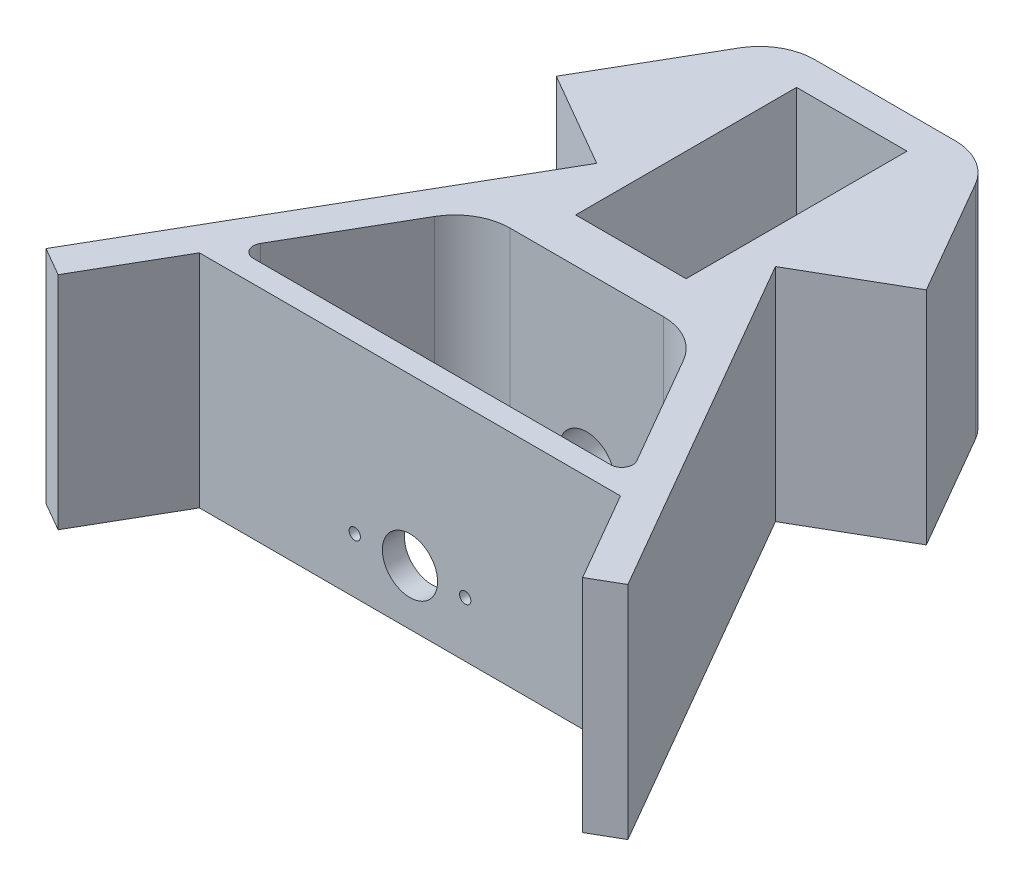
ISO-10303-21;
HEADER;
FILE_DESCRIPTION(('STEP AP214'),'2;1');
FILE_NAME('part.step','',(''),(''),'','','');
FILE_SCHEMA(('AUTOMOTIVE_DESIGN { 1 0 10303 214 1 1 1 1 }'));
ENDSEC;
DATA;
#1=APPLICATION_CONTEXT('core data for automotive mechanical design processes');
#2=APPLICATION_PROTOCOL_DEFINITION('international standard','automotive_design',2000,#1);
#3=PRODUCT_CONTEXT('',#1,'mechanical');
#4=PRODUCT('Part','Part','',(#3));
#5=PRODUCT_RELATED_PRODUCT_CATEGORY('part','',(#4));
#6=PRODUCT_DEFINITION_FORMATION('','',#4);
#7=PRODUCT_DEFINITION_CONTEXT('part definition',#1,'design');
#8=PRODUCT_DEFINITION('design','',#6,#7);
#9=PRODUCT_DEFINITION_SHAPE('','',#8);
#10=(LENGTH_UNIT() NAMED_UNIT(*) SI_UNIT(.MILLI.,.METRE.));
#11=(NAMED_UNIT(*) PLANE_ANGLE_UNIT() SI_UNIT($,.RADIAN.));
#12=(NAMED_UNIT(*) SI_UNIT($,.STERADIAN.) SOLID_ANGLE_UNIT());
#13=UNCERTAINTY_MEASURE_WITH_UNIT(LENGTH_MEASURE(1.E-05),#10,'distance_accuracy_value','');
#14=(GEOMETRIC_REPRESENTATION_CONTEXT(3) GLOBAL_UNCERTAINTY_ASSIGNED_CONTEXT((#13)) GLOBAL_UNIT_ASSIGNED_CONTEXT((#10,
#11,#12)) REPRESENTATION_CONTEXT('',''));
#15=CARTESIAN_POINT('',(0.,0.,0.));
#16=DIRECTION('',(0.,0.,1.));
#17=DIRECTION('',(1.,0.,0.));
#18=AXIS2_PLACEMENT_3D('',#15,#16,#17);
#19=CARTESIAN_POINT('',(35.8094010767585,20.,46.0000000000005));
#20=DIRECTION('',(0.,0.,-1.));
#21=DIRECTION('',(-1.,0.,0.));
#22=AXIS2_PLACEMENT_3D('',#19,#20,#21);
#23=PLANE('',#22);
#24=DIRECTION('',(1.,0.,0.));
#25=VECTOR('',#24,1.);
#26=CARTESIAN_POINT('',(35.8094010767585,20.,46.0000000000005));
#27=LINE('',#26,#25);
#28=CARTESIAN_POINT('',(-32.3452994616208,20.,46.0000000000005));
#29=VERTEX_POINT('',#28);
#30=CARTESIAN_POINT('',(32.3452994616207,20.,46.0000000000005));
#31=VERTEX_POINT('',#30);
#32=EDGE_CURVE('E245',#29,#31,#27,.T.);
#33=ORIENTED_EDGE('',*,*,#32,.T.);
#34=DIRECTION('',(0.,-1.,0.));
#35=VECTOR('',#34,1.);
#36=CARTESIAN_POINT('',(32.3452994616207,-20.,46.0000000000005));
#37=LINE('',#36,#35);
#38=CARTESIAN_POINT('',(32.3452994616207,-20.,46.0000000000005));
#39=VERTEX_POINT('',#38);
#40=EDGE_CURVE('E378',#31,#39,#37,.T.);
#41=ORIENTED_EDGE('',*,*,#40,.T.);
#42=DIRECTION('',(1.,0.,0.));
#43=VECTOR('',#42,1.);
#44=CARTESIAN_POINT('',(35.8094010767585,-20.,46.0000000000005));
#45=LINE('',#44,#43);
#46=CARTESIAN_POINT('',(-32.3452994616208,-20.,46.0000000000005));
#47=VERTEX_POINT('',#46);
#48=EDGE_CURVE('E394',#47,#39,#45,.T.);
#49=ORIENTED_EDGE('',*,*,#48,.F.);
#50=DIRECTION('',(0.,-1.,0.));
#51=VECTOR('',#50,1.);
#52=CARTESIAN_POINT('',(-32.3452994616207,20.,46.0000000000005));
#53=LINE('',#52,#51);
#54=EDGE_CURVE('E376',#47,#29,#53,.F.);
#55=ORIENTED_EDGE('',*,*,#54,.T.);
#56=EDGE_LOOP('',(#33,#41,#49,#55));
#57=FACE_BOUND('',#56,.T.);
#58=CARTESIAN_POINT('',(0.,-10.,46.0000000000005));
#59=DIRECTION('',(0.,0.,-1.));
#60=DIRECTION('',(-1.,0.,0.));
#61=AXIS2_PLACEMENT_3D('',#58,#59,#60);
#62=CIRCLE('',#61,5.);
#63=CARTESIAN_POINT('',(-5.,-10.,46.0000000000005));
#64=VERTEX_POINT('',#63);
#65=EDGE_CURVE('E40',#64,#64,#62,.T.);
#66=ORIENTED_EDGE('',*,*,#65,.F.);
#67=EDGE_LOOP('',(#66));
#68=FACE_BOUND('',#67,.T.);
#69=CARTESIAN_POINT('',(10.,-10.,46.0000000000005));
#70=DIRECTION('',(0.,0.,-1.));
#71=DIRECTION('',(-1.,0.,0.));
#72=AXIS2_PLACEMENT_3D('',#69,#70,#71);
#73=CIRCLE('',#72,1.025);
#74=CARTESIAN_POINT('',(8.975,-10.,46.0000000000005));
#75=VERTEX_POINT('',#74);
#76=EDGE_CURVE('E592',#75,#75,#73,.F.);
#77=ORIENTED_EDGE('',*,*,#76,.T.);
#78=EDGE_LOOP('',(#77));
#79=FACE_BOUND('',#78,.T.);
#80=CARTESIAN_POINT('',(-10.,-10.,46.0000000000005));
#81=DIRECTION('',(0.,0.,-1.));
#82=DIRECTION('',(-1.,0.,0.));
#83=AXIS2_PLACEMENT_3D('',#80,#81,#82);
#84=CIRCLE('',#83,1.025);
#85=CARTESIAN_POINT('',(-11.025,-10.,46.0000000000005));
#86=VERTEX_POINT('',#85);
#87=EDGE_CURVE('E598',#86,#86,#84,.F.);
#88=ORIENTED_EDGE('',*,*,#87,.T.);
#89=EDGE_LOOP('',(#88));
#90=FACE_BOUND('',#89,.T.);
#91=ADVANCED_FACE('F36',(#57,#68,#79,#90),#23,.T.);
#92=CARTESIAN_POINT('',(0.,20.,0.));
#93=DIRECTION('',(0.,-1.,0.));
#94=DIRECTION('',(0.,0.,-1.));
#95=AXIS2_PLACEMENT_3D('',#92,#93,#94);
#96=PLANE('',#95);
#97=DIRECTION('',(0.,0.,1.));
#98=VECTOR('',#97,1.);
#99=CARTESIAN_POINT('',(-10.,20.,10.0000000000004));
#100=LINE('',#99,#98);
#101=CARTESIAN_POINT('',(-10.,20.,-29.9999999999995));
#102=VERTEX_POINT('',#101);
#103=CARTESIAN_POINT('',(-10.,20.,10.0000000000004));
#104=VERTEX_POINT('',#103);
#105=EDGE_CURVE('E211',#102,#104,#100,.T.);
#106=ORIENTED_EDGE('',*,*,#105,.F.);
#107=DIRECTION('',(-1.,0.,0.));
#108=VECTOR('',#107,1.);
#109=CARTESIAN_POINT('',(10.,20.,-29.9999999999995));
#110=LINE('',#109,#108);
#111=CARTESIAN_POINT('',(10.,20.,-29.9999999999995));
#112=VERTEX_POINT('',#111);
#113=EDGE_CURVE('E238',#112,#102,#110,.T.);
#114=ORIENTED_EDGE('',*,*,#113,.F.);
#115=DIRECTION('',(0.,0.,-1.));
#116=VECTOR('',#115,1.);
#117=CARTESIAN_POINT('',(10.,20.,10.0000000000004));
#118=LINE('',#117,#116);
#119=CARTESIAN_POINT('',(10.,20.,10.0000000000004));
#120=VERTEX_POINT('',#119);
#121=EDGE_CURVE('E236',#120,#112,#118,.T.);
#122=ORIENTED_EDGE('',*,*,#121,.F.);
#123=DIRECTION('',(1.,0.,0.));
#124=VECTOR('',#123,1.);
#125=CARTESIAN_POINT('',(10.,20.,10.0000000000004));
#126=LINE('',#125,#124);
#127=EDGE_CURVE('E221',#104,#120,#126,.T.);
#128=ORIENTED_EDGE('',*,*,#127,.F.);
#129=EDGE_LOOP('',(#106,#114,#122,#128));
#130=FACE_BOUND('',#129,.T.);
#131=DIRECTION('',(-1.,0.,0.));
#132=VECTOR('',#131,1.);
#133=CARTESIAN_POINT('',(18.48889300107,20.,-35.9999999999995));
#134=LINE('',#133,#132);
#135=CARTESIAN_POINT('',(12.7153903091737,20.,-35.9999999999995));
#136=VERTEX_POINT('',#135);
#137=CARTESIAN_POINT('',(-12.7153903091737,20.,-35.9999999999996));
#138=VERTEX_POINT('',#137);
#139=EDGE_CURVE('E273',#136,#138,#134,.T.);
#140=ORIENTED_EDGE('',*,*,#139,.T.);
#141=CARTESIAN_POINT('',(-12.7153903091737,20.,-25.9999999999996));
#142=DIRECTION('',(0.,-1.,0.));
#143=DIRECTION('',(0.,0.,-1.));
#144=AXIS2_PLACEMENT_3D('',#141,#142,#143);
#145=CIRCLE('',#144,10.);
#146=CARTESIAN_POINT('',(-21.3756443470181,20.,-30.9999999999995));
#147=VERTEX_POINT('',#146);
#148=EDGE_CURVE('E363',#138,#147,#145,.F.);
#149=ORIENTED_EDGE('',*,*,#148,.T.);
#150=DIRECTION('',(-0.499999999999998,0.,0.86602540378444));
#151=VECTOR('',#150,1.);
#152=CARTESIAN_POINT('',(-18.48889300107,20.,-35.9999999999996));
#153=LINE('',#152,#151);
#154=CARTESIAN_POINT('',(-33.5000000000002,20.,-9.99999999999941));
#155=VERTEX_POINT('',#154);
#156=EDGE_CURVE('E276',#147,#155,#153,.T.);
#157=ORIENTED_EDGE('',*,*,#156,.T.);
#158=DIRECTION('',(0.866025403784451,0.,0.499999999999978));
#159=VECTOR('',#158,1.);
#160=CARTESIAN_POINT('',(-33.5000000000002,20.,-9.99999999999941));
#161=LINE('',#160,#159);
#162=CARTESIAN_POINT('',(-16.1794919243112,20.,1.5231539567342E-13));
#163=VERTEX_POINT('',#162);
#164=EDGE_CURVE('E278',#155,#163,#161,.T.);
#165=ORIENTED_EDGE('',*,*,#164,.T.);
#166=DIRECTION('',(-0.499999999999998,0.,0.86602540378444));
#167=VECTOR('',#166,1.);
#168=CARTESIAN_POINT('',(-16.1794919243112,20.,1.5231539567342E-13));
#169=LINE('',#168,#167);
#170=CARTESIAN_POINT('',(-52.6794919243111,20.,63.2198544762643));
#171=VERTEX_POINT('',#170);
#172=EDGE_CURVE('E280',#163,#171,#169,.T.);
#173=ORIENTED_EDGE('',*,*,#172,.T.);
#174=DIRECTION('',(0.866025403784438,0.,0.500000000000001));
#175=VECTOR('',#174,1.);
#176=CARTESIAN_POINT('',(-52.6794919243111,20.,63.2198544762643));
#177=LINE('',#176,#175);
#178=CARTESIAN_POINT('',(-47.4833395016044,20.,66.2198544762643));
#179=VERTEX_POINT('',#178);
#180=EDGE_CURVE('E282',#171,#179,#177,.T.);
#181=ORIENTED_EDGE('',*,*,#180,.T.);
#182=DIRECTION('',(0.5,0.,-0.866025403784439));
#183=VECTOR('',#182,1.);
#184=CARTESIAN_POINT('',(-47.4833395016044,20.,66.2198544762643));
#185=LINE('',#184,#183);
#186=CARTESIAN_POINT('',(-38.118802153517,20.,50.0000000000005));
#187=VERTEX_POINT('',#186);
#188=EDGE_CURVE('E256',#179,#187,#185,.T.);
#189=ORIENTED_EDGE('',*,*,#188,.T.);
#190=DIRECTION('',(1.,0.,0.));
#191=VECTOR('',#190,1.);
#192=CARTESIAN_POINT('',(-38.118802153517,20.,50.0000000000005));
#193=LINE('',#192,#191);
#194=CARTESIAN_POINT('',(38.118802153517,20.,50.0000000000005));
#195=VERTEX_POINT('',#194);
#196=EDGE_CURVE('E259',#187,#195,#193,.T.);
#197=ORIENTED_EDGE('',*,*,#196,.T.);
#198=DIRECTION('',(0.5,0.,0.866025403784439));
#199=VECTOR('',#198,1.);
#200=CARTESIAN_POINT('',(38.118802153517,20.,50.0000000000005));
#201=LINE('',#200,#199);
#202=CARTESIAN_POINT('',(47.4833395016045,20.,66.2198544762645));
#203=VERTEX_POINT('',#202);
#204=EDGE_CURVE('E262',#195,#203,#201,.T.);
#205=ORIENTED_EDGE('',*,*,#204,.T.);
#206=DIRECTION('',(0.866025403784422,0.,-0.50000000000003));
#207=VECTOR('',#206,1.);
#208=CARTESIAN_POINT('',(47.4833395016045,20.,66.2198544762645));
#209=LINE('',#208,#207);
#210=CARTESIAN_POINT('',(52.6794919243111,20.,63.2198544762643));
#211=VERTEX_POINT('',#210);
#212=EDGE_CURVE('E264',#203,#211,#209,.T.);
#213=ORIENTED_EDGE('',*,*,#212,.T.);
#214=DIRECTION('',(-0.499999999999998,0.,-0.86602540378444));
#215=VECTOR('',#214,1.);
#216=CARTESIAN_POINT('',(52.6794919243111,20.,63.2198544762643));
#217=LINE('',#216,#215);
#218=CARTESIAN_POINT('',(16.1794919243112,20.,1.5231539567342E-13));
#219=VERTEX_POINT('',#218);
#220=EDGE_CURVE('E266',#211,#219,#217,.T.);
#221=ORIENTED_EDGE('',*,*,#220,.T.);
#222=DIRECTION('',(0.86602540378444,0.,-0.499999999999998));
#223=VECTOR('',#222,1.);
#224=CARTESIAN_POINT('',(16.1794919243112,20.,1.5231539567342E-13));
#225=LINE('',#224,#223);
#226=CARTESIAN_POINT('',(33.5,20.,-9.99999999999981));
#227=VERTEX_POINT('',#226);
#228=EDGE_CURVE('E268',#219,#227,#225,.T.);
#229=ORIENTED_EDGE('',*,*,#228,.T.);
#230=DIRECTION('',(-0.499999999999998,0.,-0.86602540378444));
#231=VECTOR('',#230,1.);
#232=CARTESIAN_POINT('',(33.5,20.,-9.99999999999981));
#233=LINE('',#232,#231);
#234=CARTESIAN_POINT('',(21.3756443470181,20.,-30.9999999999995));
#235=VERTEX_POINT('',#234);
#236=EDGE_CURVE('E270',#227,#235,#233,.T.);
#237=ORIENTED_EDGE('',*,*,#236,.T.);
#238=CARTESIAN_POINT('',(12.7153903091737,20.,-25.9999999999995));
#239=DIRECTION('',(0.,-1.,0.));
#240=DIRECTION('',(0.,0.,-1.));
#241=AXIS2_PLACEMENT_3D('',#238,#239,#240);
#242=CIRCLE('',#241,10.);
#243=EDGE_CURVE('E361',#235,#136,#242,.F.);
#244=ORIENTED_EDGE('',*,*,#243,.T.);
#245=EDGE_LOOP('',(#140,#149,#157,#165,#173,#181,#189,#197,#205,#213,#221,#229,#237,#244));
#246=FACE_BOUND('',#245,.T.);
#247=DIRECTION('',(-0.499999999999997,0.,-0.86602540378444));
#248=VECTOR('',#247,1.);
#249=CARTESIAN_POINT('',(19.6435935394491,20.,18.0000000000005));
#250=LINE('',#249,#248);
#251=CARTESIAN_POINT('',(34.0773502691896,20.,43.0000000000005));
#252=VERTEX_POINT('',#251);
#253=CARTESIAN_POINT('',(22.5303448853972,20.,23.0000000000005));
#254=VERTEX_POINT('',#253);
#255=EDGE_CURVE('E401',#252,#254,#250,.T.);
#256=ORIENTED_EDGE('',*,*,#255,.F.);
#257=CARTESIAN_POINT('',(32.3452994616207,20.,44.0000000000005));
#258=DIRECTION('',(0.,-1.,0.));
#259=DIRECTION('',(0.,0.,-1.));
#260=AXIS2_PLACEMENT_3D('',#257,#258,#259);
#261=CIRCLE('',#260,2.);
#262=EDGE_CURVE('E387',#252,#31,#261,.T.);
#263=ORIENTED_EDGE('',*,*,#262,.T.);
#264=ORIENTED_EDGE('',*,*,#32,.F.);
#265=CARTESIAN_POINT('',(-32.3452994616207,20.,44.0000000000005));
#266=DIRECTION('',(0.,-1.,0.));
#267=DIRECTION('',(0.,0.,-1.));
#268=AXIS2_PLACEMENT_3D('',#265,#266,#267);
#269=CIRCLE('',#268,2.);
#270=CARTESIAN_POINT('',(-34.0773502691896,20.,43.0000000000005));
#271=VERTEX_POINT('',#270);
#272=EDGE_CURVE('E11',#29,#271,#269,.T.);
#273=ORIENTED_EDGE('',*,*,#272,.T.);
#274=DIRECTION('',(-0.499999999999998,0.,0.86602540378444));
#275=VECTOR('',#274,1.);
#276=CARTESIAN_POINT('',(-35.8094010767585,20.,46.0000000000005));
#277=LINE('',#276,#275);
#278=CARTESIAN_POINT('',(-22.5303448853972,20.,23.0000000000005));
#279=VERTEX_POINT('',#278);
#280=EDGE_CURVE('E405',#279,#271,#277,.T.);
#281=ORIENTED_EDGE('',*,*,#280,.F.);
#282=CARTESIAN_POINT('',(-13.8700908475528,20.,28.0000000000005));
#283=DIRECTION('',(0.,-1.,0.));
#284=DIRECTION('',(0.,0.,-1.));
#285=AXIS2_PLACEMENT_3D('',#282,#283,#284);
#286=CIRCLE('',#285,10.);
#287=CARTESIAN_POINT('',(-13.8700908475528,20.,18.0000000000005));
#288=VERTEX_POINT('',#287);
#289=EDGE_CURVE('E374',#279,#288,#286,.T.);
#290=ORIENTED_EDGE('',*,*,#289,.T.);
#291=DIRECTION('',(-1.,0.,0.));
#292=VECTOR('',#291,1.);
#293=CARTESIAN_POINT('',(-19.6435935394491,20.,18.0000000000005));
#294=LINE('',#293,#292);
#295=CARTESIAN_POINT('',(13.8700908475528,20.,18.0000000000005));
#296=VERTEX_POINT('',#295);
#297=EDGE_CURVE('E407',#296,#288,#294,.T.);
#298=ORIENTED_EDGE('',*,*,#297,.F.);
#299=CARTESIAN_POINT('',(13.8700908475528,20.,28.0000000000005));
#300=DIRECTION('',(0.,-1.,0.));
#301=DIRECTION('',(0.,0.,-1.));
#302=AXIS2_PLACEMENT_3D('',#299,#300,#301);
#303=CIRCLE('',#302,10.);
#304=EDGE_CURVE('E369',#296,#254,#303,.T.);
#305=ORIENTED_EDGE('',*,*,#304,.T.);
#306=EDGE_LOOP('',(#256,#263,#264,#273,#281,#290,#298,#305));
#307=FACE_BOUND('',#306,.T.);
#308=ADVANCED_FACE('F233',(#130,#246,#307),#96,.F.);
#309=CARTESIAN_POINT('',(0.,-20.,0.));
#310=DIRECTION('',(0.,-1.,0.));
#311=DIRECTION('',(0.,0.,-1.));
#312=AXIS2_PLACEMENT_3D('',#309,#310,#311);
#313=PLANE('',#312);
#314=DIRECTION('',(-0.499999999999998,0.,0.86602540378444));
#315=VECTOR('',#314,1.);
#316=CARTESIAN_POINT('',(-18.48889300107,-20.,-35.9999999999996));
#317=LINE('',#316,#315);
#318=CARTESIAN_POINT('',(-21.3756443470181,-20.,-30.9999999999995));
#319=VERTEX_POINT('',#318);
#320=CARTESIAN_POINT('',(-33.5000000000002,-20.,-9.99999999999941));
#321=VERTEX_POINT('',#320);
#322=EDGE_CURVE('E303',#319,#321,#317,.T.);
#323=ORIENTED_EDGE('',*,*,#322,.F.);
#324=CARTESIAN_POINT('',(-12.7153903091737,-20.,-25.9999999999996));
#325=DIRECTION('',(0.,-1.,0.));
#326=DIRECTION('',(0.,0.,-1.));
#327=AXIS2_PLACEMENT_3D('',#324,#325,#326);
#328=CIRCLE('',#327,10.);
#329=CARTESIAN_POINT('',(-12.7153903091737,-20.,-35.9999999999996));
#330=VERTEX_POINT('',#329);
#331=EDGE_CURVE('E354',#319,#330,#328,.T.);
#332=ORIENTED_EDGE('',*,*,#331,.T.);
#333=DIRECTION('',(-1.,0.,0.));
#334=VECTOR('',#333,1.);
#335=CARTESIAN_POINT('',(18.48889300107,-20.,-35.9999999999995));
#336=LINE('',#335,#334);
#337=CARTESIAN_POINT('',(12.7153903091737,-20.,-35.9999999999995));
#338=VERTEX_POINT('',#337);
#339=EDGE_CURVE('E300',#338,#330,#336,.T.);
#340=ORIENTED_EDGE('',*,*,#339,.F.);
#341=CARTESIAN_POINT('',(12.7153903091737,-20.,-25.9999999999995));
#342=DIRECTION('',(0.,-1.,0.));
#343=DIRECTION('',(0.,0.,-1.));
#344=AXIS2_PLACEMENT_3D('',#341,#342,#343);
#345=CIRCLE('',#344,10.);
#346=CARTESIAN_POINT('',(21.3756443470181,-20.,-30.9999999999995));
#347=VERTEX_POINT('',#346);
#348=EDGE_CURVE('E352',#338,#347,#345,.T.);
#349=ORIENTED_EDGE('',*,*,#348,.T.);
#350=DIRECTION('',(-0.499999999999998,0.,-0.86602540378444));
#351=VECTOR('',#350,1.);
#352=CARTESIAN_POINT('',(33.5,-20.,-9.99999999999981));
#353=LINE('',#352,#351);
#354=CARTESIAN_POINT('',(33.5,-20.,-9.99999999999981));
#355=VERTEX_POINT('',#354);
#356=EDGE_CURVE('E297',#355,#347,#353,.T.);
#357=ORIENTED_EDGE('',*,*,#356,.F.);
#358=DIRECTION('',(0.86602540378444,0.,-0.499999999999998));
#359=VECTOR('',#358,1.);
#360=CARTESIAN_POINT('',(16.1794919243112,-20.,1.5231539567342E-13));
#361=LINE('',#360,#359);
#362=CARTESIAN_POINT('',(16.1794919243112,-20.,1.5231539567342E-13));
#363=VERTEX_POINT('',#362);
#364=EDGE_CURVE('E295',#363,#355,#361,.T.);
#365=ORIENTED_EDGE('',*,*,#364,.F.);
#366=DIRECTION('',(-0.499999999999998,0.,-0.86602540378444));
#367=VECTOR('',#366,1.);
#368=CARTESIAN_POINT('',(52.6794919243111,-20.,63.2198544762643));
#369=LINE('',#368,#367);
#370=CARTESIAN_POINT('',(52.6794919243111,-20.,63.2198544762643));
#371=VERTEX_POINT('',#370);
#372=EDGE_CURVE('E293',#371,#363,#369,.T.);
#373=ORIENTED_EDGE('',*,*,#372,.F.);
#374=DIRECTION('',(0.866025403784422,0.,-0.50000000000003));
#375=VECTOR('',#374,1.);
#376=CARTESIAN_POINT('',(47.4833395016045,-20.,66.2198544762645));
#377=LINE('',#376,#375);
#378=CARTESIAN_POINT('',(47.4833395016045,-20.,66.2198544762645));
#379=VERTEX_POINT('',#378);
#380=EDGE_CURVE('E291',#379,#371,#377,.T.);
#381=ORIENTED_EDGE('',*,*,#380,.F.);
#382=DIRECTION('',(0.5,0.,0.866025403784439));
#383=VECTOR('',#382,1.);
#384=CARTESIAN_POINT('',(38.118802153517,-20.,50.0000000000005));
#385=LINE('',#384,#383);
#386=CARTESIAN_POINT('',(38.118802153517,-20.,50.0000000000005));
#387=VERTEX_POINT('',#386);
#388=EDGE_CURVE('E289',#387,#379,#385,.T.);
#389=ORIENTED_EDGE('',*,*,#388,.F.);
#390=DIRECTION('',(1.,0.,0.));
#391=VECTOR('',#390,1.);
#392=CARTESIAN_POINT('',(-38.118802153517,-20.,50.0000000000005));
#393=LINE('',#392,#391);
#394=CARTESIAN_POINT('',(-38.118802153517,-20.,50.0000000000005));
#395=VERTEX_POINT('',#394);
#396=EDGE_CURVE('E287',#395,#387,#393,.T.);
#397=ORIENTED_EDGE('',*,*,#396,.F.);
#398=DIRECTION('',(0.5,0.,-0.866025403784439));
#399=VECTOR('',#398,1.);
#400=CARTESIAN_POINT('',(-47.4833395016044,-20.,66.2198544762643));
#401=LINE('',#400,#399);
#402=CARTESIAN_POINT('',(-47.4833395016044,-20.,66.2198544762643));
#403=VERTEX_POINT('',#402);
#404=EDGE_CURVE('E229',#403,#395,#401,.T.);
#405=ORIENTED_EDGE('',*,*,#404,.F.);
#406=DIRECTION('',(0.866025403784438,0.,0.500000000000001));
#407=VECTOR('',#406,1.);
#408=CARTESIAN_POINT('',(-52.6794919243111,-20.,63.2198544762643));
#409=LINE('',#408,#407);
#410=CARTESIAN_POINT('',(-52.6794919243111,-20.,63.2198544762643));
#411=VERTEX_POINT('',#410);
#412=EDGE_CURVE('E260',#411,#403,#409,.T.);
#413=ORIENTED_EDGE('',*,*,#412,.F.);
#414=DIRECTION('',(-0.499999999999998,0.,0.86602540378444));
#415=VECTOR('',#414,1.);
#416=CARTESIAN_POINT('',(-16.1794919243112,-20.,1.5231539567342E-13));
#417=LINE('',#416,#415);
#418=CARTESIAN_POINT('',(-16.1794919243112,-20.,1.5231539567342E-13));
#419=VERTEX_POINT('',#418);
#420=EDGE_CURVE('E307',#419,#411,#417,.T.);
#421=ORIENTED_EDGE('',*,*,#420,.F.);
#422=DIRECTION('',(0.866025403784451,0.,0.499999999999978));
#423=VECTOR('',#422,1.);
#424=CARTESIAN_POINT('',(-33.5000000000002,-20.,-9.99999999999941));
#425=LINE('',#424,#423);
#426=EDGE_CURVE('E305',#321,#419,#425,.T.);
#427=ORIENTED_EDGE('',*,*,#426,.F.);
#428=EDGE_LOOP('',(#323,#332,#340,#349,#357,#365,#373,#381,#389,#397,#405,#413,#421,#427));
#429=FACE_BOUND('',#428,.T.);
#430=DIRECTION('',(-1.,0.,0.));
#431=VECTOR('',#430,1.);
#432=CARTESIAN_POINT('',(10.,-20.,-29.9999999999995));
#433=LINE('',#432,#431);
#434=CARTESIAN_POINT('',(10.,-20.,-29.9999999999995));
#435=VERTEX_POINT('',#434);
#436=CARTESIAN_POINT('',(-10.,-20.,-29.9999999999995));
#437=VERTEX_POINT('',#436);
#438=EDGE_CURVE('E222',#435,#437,#433,.T.);
#439=ORIENTED_EDGE('',*,*,#438,.T.);
#440=DIRECTION('',(0.,0.,1.));
#441=VECTOR('',#440,1.);
#442=CARTESIAN_POINT('',(-10.,-20.,10.0000000000004));
#443=LINE('',#442,#441);
#444=CARTESIAN_POINT('',(-10.,-20.,10.0000000000004));
#445=VERTEX_POINT('',#444);
#446=EDGE_CURVE('E243',#437,#445,#443,.T.);
#447=ORIENTED_EDGE('',*,*,#446,.T.);
#448=DIRECTION('',(1.,0.,0.));
#449=VECTOR('',#448,1.);
#450=CARTESIAN_POINT('',(10.,-20.,10.0000000000004));
#451=LINE('',#450,#449);
#452=CARTESIAN_POINT('',(10.,-20.,10.0000000000004));
#453=VERTEX_POINT('',#452);
#454=EDGE_CURVE('E228',#445,#453,#451,.T.);
#455=ORIENTED_EDGE('',*,*,#454,.T.);
#456=DIRECTION('',(0.,0.,-1.));
#457=VECTOR('',#456,1.);
#458=CARTESIAN_POINT('',(10.,-20.,10.0000000000004));
#459=LINE('',#458,#457);
#460=EDGE_CURVE('E247',#453,#435,#459,.T.);
#461=ORIENTED_EDGE('',*,*,#460,.T.);
#462=EDGE_LOOP('',(#439,#447,#455,#461));
#463=FACE_BOUND('',#462,.T.);
#464=DIRECTION('',(-0.499999999999998,0.,0.86602540378444));
#465=VECTOR('',#464,1.);
#466=CARTESIAN_POINT('',(-35.8094010767585,-20.,46.0000000000005));
#467=LINE('',#466,#465);
#468=CARTESIAN_POINT('',(-22.5303448853972,-20.,23.0000000000005));
#469=VERTEX_POINT('',#468);
#470=CARTESIAN_POINT('',(-34.0773502691896,-20.,43.0000000000005));
#471=VERTEX_POINT('',#470);
#472=EDGE_CURVE('E396',#469,#471,#467,.T.);
#473=ORIENTED_EDGE('',*,*,#472,.T.);
#474=CARTESIAN_POINT('',(-32.3452994616207,-20.,44.0000000000005));
#475=DIRECTION('',(0.,-1.,0.));
#476=DIRECTION('',(0.,0.,-1.));
#477=AXIS2_PLACEMENT_3D('',#474,#475,#476);
#478=CIRCLE('',#477,2.);
#479=EDGE_CURVE('E45',#471,#47,#478,.F.);
#480=ORIENTED_EDGE('',*,*,#479,.T.);
#481=ORIENTED_EDGE('',*,*,#48,.T.);
#482=CARTESIAN_POINT('',(32.3452994616207,-20.,44.0000000000005));
#483=DIRECTION('',(0.,-1.,0.));
#484=DIRECTION('',(0.,0.,-1.));
#485=AXIS2_PLACEMENT_3D('',#482,#483,#484);
#486=CIRCLE('',#485,2.);
#487=CARTESIAN_POINT('',(34.0773502691896,-20.,43.0000000000005));
#488=VERTEX_POINT('',#487);
#489=EDGE_CURVE('E385',#39,#488,#486,.F.);
#490=ORIENTED_EDGE('',*,*,#489,.T.);
#491=DIRECTION('',(-0.499999999999997,0.,-0.86602540378444));
#492=VECTOR('',#491,1.);
#493=CARTESIAN_POINT('',(19.6435935394491,-20.,18.0000000000005));
#494=LINE('',#493,#492);
#495=CARTESIAN_POINT('',(22.5303448853972,-20.,23.0000000000005));
#496=VERTEX_POINT('',#495);
#497=EDGE_CURVE('E414',#488,#496,#494,.T.);
#498=ORIENTED_EDGE('',*,*,#497,.T.);
#499=CARTESIAN_POINT('',(13.8700908475528,-20.,28.0000000000005));
#500=DIRECTION('',(0.,-1.,0.));
#501=DIRECTION('',(0.,0.,-1.));
#502=AXIS2_PLACEMENT_3D('',#499,#500,#501);
#503=CIRCLE('',#502,10.);
#504=CARTESIAN_POINT('',(13.8700908475528,-20.,18.0000000000005));
#505=VERTEX_POINT('',#504);
#506=EDGE_CURVE('E367',#496,#505,#503,.F.);
#507=ORIENTED_EDGE('',*,*,#506,.T.);
#508=DIRECTION('',(-1.,0.,0.));
#509=VECTOR('',#508,1.);
#510=CARTESIAN_POINT('',(-19.6435935394491,-20.,18.0000000000005));
#511=LINE('',#510,#509);
#512=CARTESIAN_POINT('',(-13.8700908475528,-20.,18.0000000000005));
#513=VERTEX_POINT('',#512);
#514=EDGE_CURVE('E416',#505,#513,#511,.T.);
#515=ORIENTED_EDGE('',*,*,#514,.T.);
#516=CARTESIAN_POINT('',(-13.8700908475528,-20.,28.0000000000005));
#517=DIRECTION('',(0.,-1.,0.));
#518=DIRECTION('',(0.,0.,-1.));
#519=AXIS2_PLACEMENT_3D('',#516,#517,#518);
#520=CIRCLE('',#519,10.);
#521=EDGE_CURVE('E372',#513,#469,#520,.F.);
#522=ORIENTED_EDGE('',*,*,#521,.T.);
#523=EDGE_LOOP('',(#473,#480,#481,#490,#498,#507,#515,#522));
#524=FACE_BOUND('',#523,.T.);
#525=ADVANCED_FACE('F393',(#429,#463,#524),#313,.T.);
#526=CARTESIAN_POINT('',(-47.4833395016044,20.,66.2198544762643));
#527=DIRECTION('',(-0.866025403784439,0.,-0.5));
#528=DIRECTION('',(-0.5,0.,0.866025403784439));
#529=AXIS2_PLACEMENT_3D('',#526,#527,#528);
#530=PLANE('',#529);
#531=ORIENTED_EDGE('',*,*,#404,.T.);
#532=DIRECTION('',(0.,-1.,0.));
#533=VECTOR('',#532,1.);
#534=CARTESIAN_POINT('',(-38.118802153517,20.,50.0000000000005));
#535=LINE('',#534,#533);
#536=EDGE_CURVE('E336',#187,#395,#535,.T.);
#537=ORIENTED_EDGE('',*,*,#536,.F.);
#538=ORIENTED_EDGE('',*,*,#188,.F.);
#539=DIRECTION('',(0.,-1.,0.));
#540=VECTOR('',#539,1.);
#541=CARTESIAN_POINT('',(-47.4833395016044,20.,66.2198544762643));
#542=LINE('',#541,#540);
#543=EDGE_CURVE('E284',#179,#403,#542,.T.);
#544=ORIENTED_EDGE('',*,*,#543,.T.);
#545=EDGE_LOOP('',(#531,#537,#538,#544));
#546=FACE_BOUND('',#545,.T.);
#547=ADVANCED_FACE('F481',(#546),#530,.F.);
#548=CARTESIAN_POINT('',(-38.118802153517,20.,50.0000000000005));
#549=DIRECTION('',(0.,0.,-1.));
#550=DIRECTION('',(-1.,0.,0.));
#551=AXIS2_PLACEMENT_3D('',#548,#549,#550);
#552=PLANE('',#551);
#553=CARTESIAN_POINT('',(-10.,-10.,50.0000000000005));
#554=DIRECTION('',(0.,0.,1.));
#555=DIRECTION('',(1.,0.,0.));
#556=AXIS2_PLACEMENT_3D('',#553,#554,#555);
#557=CIRCLE('',#556,1.025);
#558=CARTESIAN_POINT('',(-8.975,-10.,50.0000000000005));
#559=VERTEX_POINT('',#558);
#560=EDGE_CURVE('E601',#559,#559,#557,.T.);
#561=ORIENTED_EDGE('',*,*,#560,.F.);
#562=EDGE_LOOP('',(#561));
#563=FACE_BOUND('',#562,.T.);
#564=CARTESIAN_POINT('',(10.,-10.,50.0000000000005));
#565=DIRECTION('',(0.,0.,1.));
#566=DIRECTION('',(1.,0.,0.));
#567=AXIS2_PLACEMENT_3D('',#564,#565,#566);
#568=CIRCLE('',#567,1.025);
#569=CARTESIAN_POINT('',(11.025,-10.,50.0000000000005));
#570=VERTEX_POINT('',#569);
#571=EDGE_CURVE('E595',#570,#570,#568,.T.);
#572=ORIENTED_EDGE('',*,*,#571,.F.);
#573=EDGE_LOOP('',(#572));
#574=FACE_BOUND('',#573,.T.);
#575=CARTESIAN_POINT('',(0.,-10.,50.0000000000005));
#576=DIRECTION('',(0.,0.,1.));
#577=DIRECTION('',(1.,0.,0.));
#578=AXIS2_PLACEMENT_3D('',#575,#576,#577);
#579=CIRCLE('',#578,5.);
#580=CARTESIAN_POINT('',(5.,-10.,50.0000000000005));
#581=VERTEX_POINT('',#580);
#582=EDGE_CURVE('E589',#581,#581,#579,.T.);
#583=ORIENTED_EDGE('',*,*,#582,.F.);
#584=EDGE_LOOP('',(#583));
#585=FACE_BOUND('',#584,.T.);
#586=ORIENTED_EDGE('',*,*,#396,.T.);
#587=DIRECTION('',(0.,-1.,0.));
#588=VECTOR('',#587,1.);
#589=CARTESIAN_POINT('',(38.118802153517,20.,50.0000000000005));
#590=LINE('',#589,#588);
#591=EDGE_CURVE('E333',#195,#387,#590,.T.);
#592=ORIENTED_EDGE('',*,*,#591,.F.);
#593=ORIENTED_EDGE('',*,*,#196,.F.);
#594=ORIENTED_EDGE('',*,*,#536,.T.);
#595=EDGE_LOOP('',(#586,#592,#593,#594));
#596=FACE_BOUND('',#595,.T.);
#597=ADVANCED_FACE('F521',(#563,#574,#585,#596),#552,.F.);
#598=CARTESIAN_POINT('',(38.118802153517,20.,50.0000000000005));
#599=DIRECTION('',(0.866025403784439,0.,-0.5));
#600=DIRECTION('',(-0.5,0.,-0.866025403784439));
#601=AXIS2_PLACEMENT_3D('',#598,#599,#600);
#602=PLANE('',#601);
#603=ORIENTED_EDGE('',*,*,#388,.T.);
#604=DIRECTION('',(0.,-1.,0.));
#605=VECTOR('',#604,1.);
#606=CARTESIAN_POINT('',(47.4833395016045,20.,66.2198544762645));
#607=LINE('',#606,#605);
#608=EDGE_CURVE('E330',#203,#379,#607,.T.);
#609=ORIENTED_EDGE('',*,*,#608,.F.);
#610=ORIENTED_EDGE('',*,*,#204,.F.);
#611=ORIENTED_EDGE('',*,*,#591,.T.);
#612=EDGE_LOOP('',(#603,#609,#610,#611));
#613=FACE_BOUND('',#612,.T.);
#614=ADVANCED_FACE('F517',(#613),#602,.F.);
#615=CARTESIAN_POINT('',(47.4833395016045,20.,66.2198544762645));
#616=DIRECTION('',(-0.50000000000003,0.,-0.866025403784422));
#617=DIRECTION('',(-0.866025403784422,0.,0.50000000000003));
#618=AXIS2_PLACEMENT_3D('',#615,#616,#617);
#619=PLANE('',#618);
#620=ORIENTED_EDGE('',*,*,#380,.T.);
#621=DIRECTION('',(0.,-1.,0.));
#622=VECTOR('',#621,1.);
#623=CARTESIAN_POINT('',(52.6794919243111,20.,63.2198544762643));
#624=LINE('',#623,#622);
#625=EDGE_CURVE('E327',#211,#371,#624,.T.);
#626=ORIENTED_EDGE('',*,*,#625,.F.);
#627=ORIENTED_EDGE('',*,*,#212,.F.);
#628=ORIENTED_EDGE('',*,*,#608,.T.);
#629=EDGE_LOOP('',(#620,#626,#627,#628));
#630=FACE_BOUND('',#629,.T.);
#631=ADVANCED_FACE('F513',(#630),#619,.F.);
#632=CARTESIAN_POINT('',(52.6794919243111,20.,63.2198544762643));
#633=DIRECTION('',(-0.86602540378444,0.,0.499999999999998));
#634=DIRECTION('',(0.499999999999998,0.,0.86602540378444));
#635=AXIS2_PLACEMENT_3D('',#632,#633,#634);
#636=PLANE('',#635);
#637=ORIENTED_EDGE('',*,*,#372,.T.);
#638=DIRECTION('',(0.,-1.,0.));
#639=VECTOR('',#638,1.);
#640=CARTESIAN_POINT('',(16.1794919243112,20.,1.5231539567342E-13));
#641=LINE('',#640,#639);
#642=EDGE_CURVE('E324',#219,#363,#641,.T.);
#643=ORIENTED_EDGE('',*,*,#642,.F.);
#644=ORIENTED_EDGE('',*,*,#220,.F.);
#645=ORIENTED_EDGE('',*,*,#625,.T.);
#646=EDGE_LOOP('',(#637,#643,#644,#645));
#647=FACE_BOUND('',#646,.T.);
#648=ADVANCED_FACE('F509',(#647),#636,.F.);
#649=CARTESIAN_POINT('',(16.1794919243112,20.,1.5231539567342E-13));
#650=DIRECTION('',(-0.499999999999998,0.,-0.86602540378444));
#651=DIRECTION('',(-0.86602540378444,0.,0.499999999999998));
#652=AXIS2_PLACEMENT_3D('',#649,#650,#651);
#653=PLANE('',#652);
#654=ORIENTED_EDGE('',*,*,#364,.T.);
#655=DIRECTION('',(0.,-1.,0.));
#656=VECTOR('',#655,1.);
#657=CARTESIAN_POINT('',(33.5,20.,-9.99999999999981));
#658=LINE('',#657,#656);
#659=EDGE_CURVE('E321',#227,#355,#658,.T.);
#660=ORIENTED_EDGE('',*,*,#659,.F.);
#661=ORIENTED_EDGE('',*,*,#228,.F.);
#662=ORIENTED_EDGE('',*,*,#642,.T.);
#663=EDGE_LOOP('',(#654,#660,#661,#662));
#664=FACE_BOUND('',#663,.T.);
#665=ADVANCED_FACE('F505',(#664),#653,.F.);
#666=CARTESIAN_POINT('',(33.5,20.,-9.99999999999981));
#667=DIRECTION('',(-0.86602540378444,0.,0.499999999999998));
#668=DIRECTION('',(0.499999999999998,0.,0.86602540378444));
#669=AXIS2_PLACEMENT_3D('',#666,#667,#668);
#670=PLANE('',#669);
#671=ORIENTED_EDGE('',*,*,#356,.T.);
#672=DIRECTION('',(0.,-1.,0.));
#673=VECTOR('',#672,1.);
#674=CARTESIAN_POINT('',(21.3756443470181,20.,-30.9999999999995));
#675=LINE('',#674,#673);
#676=EDGE_CURVE('E365',#347,#235,#675,.F.);
#677=ORIENTED_EDGE('',*,*,#676,.T.);
#678=ORIENTED_EDGE('',*,*,#236,.F.);
#679=ORIENTED_EDGE('',*,*,#659,.T.);
#680=EDGE_LOOP('',(#671,#677,#678,#679));
#681=FACE_BOUND('',#680,.T.);
#682=ADVANCED_FACE('F501',(#681),#670,.F.);
#683=CARTESIAN_POINT('',(18.48889300107,20.,-35.9999999999995));
#684=DIRECTION('',(0.,0.,1.));
#685=DIRECTION('',(1.,0.,0.));
#686=AXIS2_PLACEMENT_3D('',#683,#684,#685);
#687=PLANE('',#686);
#688=ORIENTED_EDGE('',*,*,#339,.T.);
#689=DIRECTION('',(0.,-1.,0.));
#690=VECTOR('',#689,1.);
#691=CARTESIAN_POINT('',(-12.7153903091737,20.,-35.9999999999996));
#692=LINE('',#691,#690);
#693=EDGE_CURVE('E359',#330,#138,#692,.F.);
#694=ORIENTED_EDGE('',*,*,#693,.T.);
#695=ORIENTED_EDGE('',*,*,#139,.F.);
#696=DIRECTION('',(0.,-1.,0.));
#697=VECTOR('',#696,1.);
#698=CARTESIAN_POINT('',(12.7153903091737,20.,-35.9999999999995));
#699=LINE('',#698,#697);
#700=EDGE_CURVE('E356',#136,#338,#699,.T.);
#701=ORIENTED_EDGE('',*,*,#700,.T.);
#702=EDGE_LOOP('',(#688,#694,#695,#701));
#703=FACE_BOUND('',#702,.T.);
#704=ADVANCED_FACE('F497',(#703),#687,.F.);
#705=CARTESIAN_POINT('',(-18.48889300107,20.,-35.9999999999996));
#706=DIRECTION('',(0.86602540378444,0.,0.499999999999998));
#707=DIRECTION('',(0.499999999999998,0.,-0.86602540378444));
#708=AXIS2_PLACEMENT_3D('',#705,#706,#707);
#709=PLANE('',#708);
#710=ORIENTED_EDGE('',*,*,#156,.F.);
#711=DIRECTION('',(0.,-1.,0.));
#712=VECTOR('',#711,1.);
#713=CARTESIAN_POINT('',(-21.3756443470181,20.,-30.9999999999995));
#714=LINE('',#713,#712);
#715=EDGE_CURVE('E349',#147,#319,#714,.T.);
#716=ORIENTED_EDGE('',*,*,#715,.T.);
#717=ORIENTED_EDGE('',*,*,#322,.T.);
#718=DIRECTION('',(0.,-1.,0.));
#719=VECTOR('',#718,1.);
#720=CARTESIAN_POINT('',(-33.5000000000002,20.,-9.99999999999941));
#721=LINE('',#720,#719);
#722=EDGE_CURVE('E318',#155,#321,#721,.T.);
#723=ORIENTED_EDGE('',*,*,#722,.F.);
#724=EDGE_LOOP('',(#710,#716,#717,#723));
#725=FACE_BOUND('',#724,.T.);
#726=ADVANCED_FACE('F493',(#725),#709,.F.);
#727=CARTESIAN_POINT('',(-33.5000000000002,20.,-9.99999999999941));
#728=DIRECTION('',(0.499999999999978,0.,-0.866025403784451));
#729=DIRECTION('',(-0.866025403784451,0.,-0.499999999999978));
#730=AXIS2_PLACEMENT_3D('',#727,#728,#729);
#731=PLANE('',#730);
#732=ORIENTED_EDGE('',*,*,#426,.T.);
#733=DIRECTION('',(0.,-1.,0.));
#734=VECTOR('',#733,1.);
#735=CARTESIAN_POINT('',(-16.1794919243112,20.,1.5231539567342E-13));
#736=LINE('',#735,#734);
#737=EDGE_CURVE('E315',#163,#419,#736,.T.);
#738=ORIENTED_EDGE('',*,*,#737,.F.);
#739=ORIENTED_EDGE('',*,*,#164,.F.);
#740=ORIENTED_EDGE('',*,*,#722,.T.);
#741=EDGE_LOOP('',(#732,#738,#739,#740));
#742=FACE_BOUND('',#741,.T.);
#743=ADVANCED_FACE('F489',(#742),#731,.F.);
#744=CARTESIAN_POINT('',(-16.1794919243112,20.,1.5231539567342E-13));
#745=DIRECTION('',(0.86602540378444,0.,0.499999999999998));
#746=DIRECTION('',(0.499999999999998,0.,-0.86602540378444));
#747=AXIS2_PLACEMENT_3D('',#744,#745,#746);
#748=PLANE('',#747);
#749=ORIENTED_EDGE('',*,*,#420,.T.);
#750=DIRECTION('',(0.,-1.,0.));
#751=VECTOR('',#750,1.);
#752=CARTESIAN_POINT('',(-52.6794919243111,20.,63.2198544762643));
#753=LINE('',#752,#751);
#754=EDGE_CURVE('E312',#171,#411,#753,.T.);
#755=ORIENTED_EDGE('',*,*,#754,.F.);
#756=ORIENTED_EDGE('',*,*,#172,.F.);
#757=ORIENTED_EDGE('',*,*,#737,.T.);
#758=EDGE_LOOP('',(#749,#755,#756,#757));
#759=FACE_BOUND('',#758,.T.);
#760=ADVANCED_FACE('F485',(#759),#748,.F.);
#761=CARTESIAN_POINT('',(-52.6794919243111,20.,63.2198544762643));
#762=DIRECTION('',(0.500000000000001,0.,-0.866025403784438));
#763=DIRECTION('',(-0.866025403784438,0.,-0.500000000000001));
#764=AXIS2_PLACEMENT_3D('',#761,#762,#763);
#765=PLANE('',#764);
#766=ORIENTED_EDGE('',*,*,#412,.T.);
#767=ORIENTED_EDGE('',*,*,#543,.F.);
#768=ORIENTED_EDGE('',*,*,#180,.F.);
#769=ORIENTED_EDGE('',*,*,#754,.T.);
#770=EDGE_LOOP('',(#766,#767,#768,#769));
#771=FACE_BOUND('',#770,.T.);
#772=ADVANCED_FACE('F477',(#771),#765,.F.);
#773=CARTESIAN_POINT('',(-10.,20.,10.0000000000004));
#774=DIRECTION('',(1.,0.,0.));
#775=DIRECTION('',(0.,0.,-1.));
#776=AXIS2_PLACEMENT_3D('',#773,#774,#775);
#777=PLANE('',#776);
#778=ORIENTED_EDGE('',*,*,#446,.F.);
#779=DIRECTION('',(0.,-1.,0.));
#780=VECTOR('',#779,1.);
#781=CARTESIAN_POINT('',(-10.,20.,-29.9999999999995));
#782=LINE('',#781,#780);
#783=EDGE_CURVE('E217',#102,#437,#782,.T.);
#784=ORIENTED_EDGE('',*,*,#783,.F.);
#785=ORIENTED_EDGE('',*,*,#105,.T.);
#786=DIRECTION('',(0.,-1.,0.));
#787=VECTOR('',#786,1.);
#788=CARTESIAN_POINT('',(-10.,20.,10.0000000000004));
#789=LINE('',#788,#787);
#790=EDGE_CURVE('E214',#104,#445,#789,.T.);
#791=ORIENTED_EDGE('',*,*,#790,.T.);
#792=EDGE_LOOP('',(#778,#784,#785,#791));
#793=FACE_BOUND('',#792,.T.);
#794=ADVANCED_FACE('F213',(#793),#777,.T.);
#795=CARTESIAN_POINT('',(10.,20.,10.0000000000004));
#796=DIRECTION('',(0.,0.,-1.));
#797=DIRECTION('',(-1.,0.,0.));
#798=AXIS2_PLACEMENT_3D('',#795,#796,#797);
#799=PLANE('',#798);
#800=CARTESIAN_POINT('',(0.,-10.,10.0000000000004));
#801=DIRECTION('',(0.,0.,-1.));
#802=DIRECTION('',(-1.,0.,0.));
#803=AXIS2_PLACEMENT_3D('',#800,#801,#802);
#804=CIRCLE('',#803,5.);
#805=CARTESIAN_POINT('',(-5.,-10.,10.0000000000004));
#806=VERTEX_POINT('',#805);
#807=EDGE_CURVE('E586',#806,#806,#804,.F.);
#808=ORIENTED_EDGE('',*,*,#807,.T.);
#809=EDGE_LOOP('',(#808));
#810=FACE_BOUND('',#809,.T.);
#811=ORIENTED_EDGE('',*,*,#454,.F.);
#812=ORIENTED_EDGE('',*,*,#790,.F.);
#813=ORIENTED_EDGE('',*,*,#127,.T.);
#814=DIRECTION('',(0.,-1.,0.));
#815=VECTOR('',#814,1.);
#816=CARTESIAN_POINT('',(10.,20.,10.0000000000004));
#817=LINE('',#816,#815);
#818=EDGE_CURVE('E230',#120,#453,#817,.T.);
#819=ORIENTED_EDGE('',*,*,#818,.T.);
#820=EDGE_LOOP('',(#811,#812,#813,#819));
#821=FACE_BOUND('',#820,.T.);
#822=ADVANCED_FACE('F225',(#810,#821),#799,.T.);
#823=CARTESIAN_POINT('',(10.,20.,10.0000000000004));
#824=DIRECTION('',(-1.,0.,0.));
#825=DIRECTION('',(0.,0.,1.));
#826=AXIS2_PLACEMENT_3D('',#823,#824,#825);
#827=PLANE('',#826);
#828=ORIENTED_EDGE('',*,*,#460,.F.);
#829=ORIENTED_EDGE('',*,*,#818,.F.);
#830=ORIENTED_EDGE('',*,*,#121,.T.);
#831=DIRECTION('',(0.,-1.,0.));
#832=VECTOR('',#831,1.);
#833=CARTESIAN_POINT('',(10.,20.,-29.9999999999995));
#834=LINE('',#833,#832);
#835=EDGE_CURVE('E253',#112,#435,#834,.T.);
#836=ORIENTED_EDGE('',*,*,#835,.T.);
#837=EDGE_LOOP('',(#828,#829,#830,#836));
#838=FACE_BOUND('',#837,.T.);
#839=ADVANCED_FACE('F468',(#838),#827,.T.);
#840=CARTESIAN_POINT('',(10.,20.,-29.9999999999995));
#841=DIRECTION('',(0.,0.,1.));
#842=DIRECTION('',(1.,0.,0.));
#843=AXIS2_PLACEMENT_3D('',#840,#841,#842);
#844=PLANE('',#843);
#845=ORIENTED_EDGE('',*,*,#438,.F.);
#846=ORIENTED_EDGE('',*,*,#835,.F.);
#847=ORIENTED_EDGE('',*,*,#113,.T.);
#848=ORIENTED_EDGE('',*,*,#783,.T.);
#849=EDGE_LOOP('',(#845,#846,#847,#848));
#850=FACE_BOUND('',#849,.T.);
#851=ADVANCED_FACE('F464',(#850),#844,.T.);
#852=CARTESIAN_POINT('',(19.6435935394491,20.,18.0000000000005));
#853=DIRECTION('',(-0.86602540378444,0.,0.499999999999998));
#854=DIRECTION('',(0.499999999999998,0.,0.86602540378444));
#855=AXIS2_PLACEMENT_3D('',#852,#853,#854);
#856=PLANE('',#855);
#857=ORIENTED_EDGE('',*,*,#497,.F.);
#858=DIRECTION('',(0.,-1.,0.));
#859=VECTOR('',#858,1.);
#860=CARTESIAN_POINT('',(34.0773502691896,20.,43.0000000000005));
#861=LINE('',#860,#859);
#862=EDGE_CURVE('E381',#488,#252,#861,.F.);
#863=ORIENTED_EDGE('',*,*,#862,.T.);
#864=ORIENTED_EDGE('',*,*,#255,.T.);
#865=DIRECTION('',(0.,-1.,0.));
#866=VECTOR('',#865,1.);
#867=CARTESIAN_POINT('',(22.5303448853972,-20.,23.0000000000005));
#868=LINE('',#867,#866);
#869=EDGE_CURVE('E339',#254,#496,#868,.T.);
#870=ORIENTED_EDGE('',*,*,#869,.T.);
#871=EDGE_LOOP('',(#857,#863,#864,#870));
#872=FACE_BOUND('',#871,.T.);
#873=ADVANCED_FACE('F460',(#872),#856,.T.);
#874=CARTESIAN_POINT('',(-19.6435935394491,20.,18.0000000000005));
#875=DIRECTION('',(0.,0.,1.));
#876=DIRECTION('',(1.,0.,0.));
#877=AXIS2_PLACEMENT_3D('',#874,#875,#876);
#878=PLANE('',#877);
#879=CARTESIAN_POINT('',(0.,-10.,18.0000000000005));
#880=DIRECTION('',(0.,0.,1.));
#881=DIRECTION('',(1.,0.,0.));
#882=AXIS2_PLACEMENT_3D('',#879,#880,#881);
#883=CIRCLE('',#882,5.);
#884=CARTESIAN_POINT('',(5.,-10.,18.0000000000005));
#885=VERTEX_POINT('',#884);
#886=EDGE_CURVE('E417',#885,#885,#883,.T.);
#887=ORIENTED_EDGE('',*,*,#886,.F.);
#888=EDGE_LOOP('',(#887));
#889=FACE_BOUND('',#888,.T.);
#890=ORIENTED_EDGE('',*,*,#514,.F.);
#891=DIRECTION('',(0.,-1.,0.));
#892=VECTOR('',#891,1.);
#893=CARTESIAN_POINT('',(13.8700908475528,20.,18.0000000000005));
#894=LINE('',#893,#892);
#895=EDGE_CURVE('E345',#505,#296,#894,.F.);
#896=ORIENTED_EDGE('',*,*,#895,.T.);
#897=ORIENTED_EDGE('',*,*,#297,.T.);
#898=DIRECTION('',(0.,-1.,0.));
#899=VECTOR('',#898,1.);
#900=CARTESIAN_POINT('',(-13.8700908475528,-20.,18.0000000000005));
#901=LINE('',#900,#899);
#902=EDGE_CURVE('E342',#288,#513,#901,.T.);
#903=ORIENTED_EDGE('',*,*,#902,.T.);
#904=EDGE_LOOP('',(#890,#896,#897,#903));
#905=FACE_BOUND('',#904,.T.);
#906=ADVANCED_FACE('F424',(#889,#905),#878,.T.);
#907=CARTESIAN_POINT('',(-35.8094010767585,20.,46.0000000000005));
#908=DIRECTION('',(0.86602540378444,0.,0.499999999999998));
#909=DIRECTION('',(0.499999999999998,0.,-0.86602540378444));
#910=AXIS2_PLACEMENT_3D('',#907,#908,#909);
#911=PLANE('',#910);
#912=ORIENTED_EDGE('',*,*,#280,.T.);
#913=DIRECTION('',(0.,-1.,0.));
#914=VECTOR('',#913,1.);
#915=CARTESIAN_POINT('',(-34.0773502691896,-20.,43.0000000000005));
#916=LINE('',#915,#914);
#917=EDGE_CURVE('E383',#271,#471,#916,.T.);
#918=ORIENTED_EDGE('',*,*,#917,.T.);
#919=ORIENTED_EDGE('',*,*,#472,.F.);
#920=DIRECTION('',(0.,-1.,0.));
#921=VECTOR('',#920,1.);
#922=CARTESIAN_POINT('',(-22.5303448853972,20.,23.0000000000005));
#923=LINE('',#922,#921);
#924=EDGE_CURVE('E347',#469,#279,#923,.F.);
#925=ORIENTED_EDGE('',*,*,#924,.T.);
#926=EDGE_LOOP('',(#912,#918,#919,#925));
#927=FACE_BOUND('',#926,.T.);
#928=ADVANCED_FACE('F403',(#927),#911,.T.);
#929=CARTESIAN_POINT('',(13.8700908475528,20.,28.0000000000005));
#930=DIRECTION('',(0.,1.,0.));
#931=DIRECTION('',(0.,0.,1.));
#932=AXIS2_PLACEMENT_3D('',#929,#930,#931);
#933=CYLINDRICAL_SURFACE('',#932,10.);
#934=ORIENTED_EDGE('',*,*,#304,.F.);
#935=ORIENTED_EDGE('',*,*,#895,.F.);
#936=ORIENTED_EDGE('',*,*,#506,.F.);
#937=ORIENTED_EDGE('',*,*,#869,.F.);
#938=EDGE_LOOP('',(#934,#935,#936,#937));
#939=FACE_BOUND('',#938,.T.);
#940=ADVANCED_FACE('F429',(#939),#933,.F.);
#941=CARTESIAN_POINT('',(-13.8700908475528,20.,28.0000000000005));
#942=DIRECTION('',(0.,1.,0.));
#943=DIRECTION('',(0.,0.,1.));
#944=AXIS2_PLACEMENT_3D('',#941,#942,#943);
#945=CYLINDRICAL_SURFACE('',#944,10.);
#946=ORIENTED_EDGE('',*,*,#289,.F.);
#947=ORIENTED_EDGE('',*,*,#924,.F.);
#948=ORIENTED_EDGE('',*,*,#521,.F.);
#949=ORIENTED_EDGE('',*,*,#902,.F.);
#950=EDGE_LOOP('',(#946,#947,#948,#949));
#951=FACE_BOUND('',#950,.T.);
#952=ADVANCED_FACE('F434',(#951),#945,.F.);
#953=CARTESIAN_POINT('',(-12.7153903091737,20.,-25.9999999999996));
#954=DIRECTION('',(0.,-1.,0.));
#955=DIRECTION('',(0.,0.,-1.));
#956=AXIS2_PLACEMENT_3D('',#953,#954,#955);
#957=CYLINDRICAL_SURFACE('',#956,10.);
#958=ORIENTED_EDGE('',*,*,#148,.F.);
#959=ORIENTED_EDGE('',*,*,#693,.F.);
#960=ORIENTED_EDGE('',*,*,#331,.F.);
#961=ORIENTED_EDGE('',*,*,#715,.F.);
#962=EDGE_LOOP('',(#958,#959,#960,#961));
#963=FACE_BOUND('',#962,.T.);
#964=ADVANCED_FACE('F436',(#963),#957,.T.);
#965=CARTESIAN_POINT('',(12.7153903091737,20.,-25.9999999999995));
#966=DIRECTION('',(0.,-1.,0.));
#967=DIRECTION('',(0.,0.,-1.));
#968=AXIS2_PLACEMENT_3D('',#965,#966,#967);
#969=CYLINDRICAL_SURFACE('',#968,10.);
#970=ORIENTED_EDGE('',*,*,#243,.F.);
#971=ORIENTED_EDGE('',*,*,#676,.F.);
#972=ORIENTED_EDGE('',*,*,#348,.F.);
#973=ORIENTED_EDGE('',*,*,#700,.F.);
#974=EDGE_LOOP('',(#970,#971,#972,#973));
#975=FACE_BOUND('',#974,.T.);
#976=ADVANCED_FACE('F442',(#975),#969,.T.);
#977=CARTESIAN_POINT('',(32.3452994616207,20.,44.0000000000005));
#978=DIRECTION('',(0.,1.,0.));
#979=DIRECTION('',(0.,0.,1.));
#980=AXIS2_PLACEMENT_3D('',#977,#978,#979);
#981=CYLINDRICAL_SURFACE('',#980,2.);
#982=ORIENTED_EDGE('',*,*,#262,.F.);
#983=ORIENTED_EDGE('',*,*,#862,.F.);
#984=ORIENTED_EDGE('',*,*,#489,.F.);
#985=ORIENTED_EDGE('',*,*,#40,.F.);
#986=EDGE_LOOP('',(#982,#983,#984,#985));
#987=FACE_BOUND('',#986,.T.);
#988=ADVANCED_FACE('F572',(#987),#981,.F.);
#989=CARTESIAN_POINT('',(-32.3452994616207,20.,44.0000000000005));
#990=DIRECTION('',(0.,1.,0.));
#991=DIRECTION('',(0.,0.,1.));
#992=AXIS2_PLACEMENT_3D('',#989,#990,#991);
#993=CYLINDRICAL_SURFACE('',#992,2.);
#994=ORIENTED_EDGE('',*,*,#272,.F.);
#995=ORIENTED_EDGE('',*,*,#54,.F.);
#996=ORIENTED_EDGE('',*,*,#479,.F.);
#997=ORIENTED_EDGE('',*,*,#917,.F.);
#998=EDGE_LOOP('',(#994,#995,#996,#997));
#999=FACE_BOUND('',#998,.T.);
#1000=ADVANCED_FACE('F38',(#999),#993,.F.);
#1001=CARTESIAN_POINT('',(0.,-10.,-4.14213562373051));
#1002=DIRECTION('',(0.,0.,1.));
#1003=DIRECTION('',(1.,0.,0.));
#1004=AXIS2_PLACEMENT_3D('',#1001,#1002,#1003);
#1005=CYLINDRICAL_SURFACE('',#1004,5.);
#1006=ORIENTED_EDGE('',*,*,#65,.T.);
#1007=EDGE_LOOP('',(#1006));
#1008=FACE_BOUND('',#1007,.T.);
#1009=ORIENTED_EDGE('',*,*,#582,.T.);
#1010=EDGE_LOOP('',(#1009));
#1011=FACE_BOUND('',#1010,.T.);
#1012=ADVANCED_FACE('F454',(#1008,#1011),#1005,.F.);
#1013=ORIENTED_EDGE('',*,*,#886,.T.);
#1014=EDGE_LOOP('',(#1013));
#1015=FACE_BOUND('',#1014,.T.);
#1016=ORIENTED_EDGE('',*,*,#807,.F.);
#1017=EDGE_LOOP('',(#1016));
#1018=FACE_BOUND('',#1017,.T.);
#1019=ADVANCED_FACE('F612',(#1015,#1018),#1005,.F.);
#1020=CARTESIAN_POINT('',(10.,-10.,50.0000000000005));
#1021=DIRECTION('',(0.,0.,1.));
#1022=DIRECTION('',(1.,0.,0.));
#1023=AXIS2_PLACEMENT_3D('',#1020,#1021,#1022);
#1024=CYLINDRICAL_SURFACE('',#1023,1.025);
#1025=ORIENTED_EDGE('',*,*,#76,.F.);
#1026=EDGE_LOOP('',(#1025));
#1027=FACE_BOUND('',#1026,.T.);
#1028=ORIENTED_EDGE('',*,*,#571,.T.);
#1029=EDGE_LOOP('',(#1028));
#1030=FACE_BOUND('',#1029,.T.);
#1031=ADVANCED_FACE('F617',(#1027,#1030),#1024,.F.);
#1032=CARTESIAN_POINT('',(-10.,-10.,50.0000000000005));
#1033=DIRECTION('',(0.,0.,1.));
#1034=DIRECTION('',(1.,0.,0.));
#1035=AXIS2_PLACEMENT_3D('',#1032,#1033,#1034);
#1036=CYLINDRICAL_SURFACE('',#1035,1.025);
#1037=ORIENTED_EDGE('',*,*,#87,.F.);
#1038=EDGE_LOOP('',(#1037));
#1039=FACE_BOUND('',#1038,.T.);
#1040=ORIENTED_EDGE('',*,*,#560,.T.);
#1041=EDGE_LOOP('',(#1040));
#1042=FACE_BOUND('',#1041,.T.);
#1043=ADVANCED_FACE('F605',(#1039,#1042),#1036,.F.);
#1044=CLOSED_SHELL('',(#91,#308,#525,#547,#597,#614,#631,#648,#665,#682,#704,#726,#743,#760,
#772,#794,#822,#839,#851,#873,#906,#928,#940,#952,#964,#976,#988,#1000,#1012,#1019,#1031,#1043));
#1045=MANIFOLD_SOLID_BREP('B2',#1044);
#1046=ADVANCED_BREP_SHAPE_REPRESENTATION('',(#18,#1045),#14);
#1047=SHAPE_DEFINITION_REPRESENTATION(#9,#1046);
ENDSEC;
END-ISO-10303-21;
